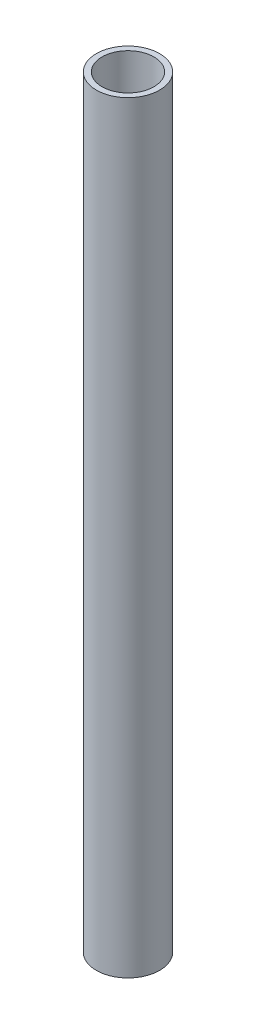
ISO-10303-21;
HEADER;
FILE_DESCRIPTION(('STEP AP214'),'2;1');
FILE_NAME('part.step','',(''),(''),'','','');
FILE_SCHEMA(('AUTOMOTIVE_DESIGN { 1 0 10303 214 1 1 1 1 }'));
ENDSEC;
DATA;
#1=APPLICATION_CONTEXT('core data for automotive mechanical design processes');
#2=APPLICATION_PROTOCOL_DEFINITION('international standard','automotive_design',2000,#1);
#3=PRODUCT_CONTEXT('',#1,'mechanical');
#4=PRODUCT('Part','Part','',(#3));
#5=PRODUCT_RELATED_PRODUCT_CATEGORY('part','',(#4));
#6=PRODUCT_DEFINITION_FORMATION('','',#4);
#7=PRODUCT_DEFINITION_CONTEXT('part definition',#1,'design');
#8=PRODUCT_DEFINITION('design','',#6,#7);
#9=PRODUCT_DEFINITION_SHAPE('','',#8);
#10=(LENGTH_UNIT() NAMED_UNIT(*) SI_UNIT(.MILLI.,.METRE.));
#11=(NAMED_UNIT(*) PLANE_ANGLE_UNIT() SI_UNIT($,.RADIAN.));
#12=(NAMED_UNIT(*) SI_UNIT($,.STERADIAN.) SOLID_ANGLE_UNIT());
#13=UNCERTAINTY_MEASURE_WITH_UNIT(LENGTH_MEASURE(1.E-05),#10,'distance_accuracy_value','');
#14=(GEOMETRIC_REPRESENTATION_CONTEXT(3) GLOBAL_UNCERTAINTY_ASSIGNED_CONTEXT((#13)) GLOBAL_UNIT_ASSIGNED_CONTEXT((#10,
#11,#12)) REPRESENTATION_CONTEXT('',''));
#15=CARTESIAN_POINT('',(0.,0.,0.));
#16=DIRECTION('',(0.,0.,1.));
#17=DIRECTION('',(1.,0.,0.));
#18=AXIS2_PLACEMENT_3D('',#15,#16,#17);
#19=CARTESIAN_POINT('',(0.,0.,0.));
#20=DIRECTION('',(0.,1.,0.));
#21=DIRECTION('',(0.,0.,1.));
#22=AXIS2_PLACEMENT_3D('',#19,#20,#21);
#23=CYLINDRICAL_SURFACE('',#22,17.272);
#24=CARTESIAN_POINT('',(0.,508.,0.));
#25=DIRECTION('',(0.,1.,0.));
#26=DIRECTION('',(0.,0.,1.));
#27=AXIS2_PLACEMENT_3D('',#24,#25,#26);
#28=CIRCLE('',#27,17.272);
#29=CARTESIAN_POINT('',(0.,508.,17.272));
#30=VERTEX_POINT('',#29);
#31=EDGE_CURVE('E18',#30,#30,#28,.F.);
#32=ORIENTED_EDGE('',*,*,#31,.F.);
#33=EDGE_LOOP('',(#32));
#34=FACE_BOUND('',#33,.T.);
#35=CARTESIAN_POINT('',(0.,0.,0.));
#36=DIRECTION('',(0.,1.,0.));
#37=DIRECTION('',(0.,0.,1.));
#38=AXIS2_PLACEMENT_3D('',#35,#36,#37);
#39=CIRCLE('',#38,17.272);
#40=CARTESIAN_POINT('',(0.,0.,17.272));
#41=VERTEX_POINT('',#40);
#42=EDGE_CURVE('E27',#41,#41,#39,.F.);
#43=ORIENTED_EDGE('',*,*,#42,.T.);
#44=EDGE_LOOP('',(#43));
#45=FACE_BOUND('',#44,.T.);
#46=ADVANCED_FACE('F15',(#34,#45),#23,.F.);
#47=CARTESIAN_POINT('',(0.,508.,0.));
#48=DIRECTION('',(0.,1.,0.));
#49=DIRECTION('',(0.,0.,1.));
#50=AXIS2_PLACEMENT_3D('',#47,#48,#49);
#51=PLANE('',#50);
#52=ORIENTED_EDGE('',*,*,#31,.T.);
#53=EDGE_LOOP('',(#52));
#54=FACE_BOUND('',#53,.T.);
#55=CARTESIAN_POINT('',(0.,508.,0.));
#56=DIRECTION('',(0.,1.,0.));
#57=DIRECTION('',(0.,0.,1.));
#58=AXIS2_PLACEMENT_3D('',#55,#56,#57);
#59=CIRCLE('',#58,21.082);
#60=CARTESIAN_POINT('',(0.,508.,21.082));
#61=VERTEX_POINT('',#60);
#62=EDGE_CURVE('E22',#61,#61,#59,.F.);
#63=ORIENTED_EDGE('',*,*,#62,.F.);
#64=EDGE_LOOP('',(#63));
#65=FACE_BOUND('',#64,.T.);
#66=ADVANCED_FACE('F35',(#54,#65),#51,.T.);
#67=CARTESIAN_POINT('',(0.,0.,0.));
#68=DIRECTION('',(0.,1.,0.));
#69=DIRECTION('',(0.,0.,1.));
#70=AXIS2_PLACEMENT_3D('',#67,#68,#69);
#71=PLANE('',#70);
#72=ORIENTED_EDGE('',*,*,#42,.F.);
#73=EDGE_LOOP('',(#72));
#74=FACE_BOUND('',#73,.T.);
#75=CARTESIAN_POINT('',(0.,0.,0.));
#76=DIRECTION('',(0.,1.,0.));
#77=DIRECTION('',(0.,0.,1.));
#78=AXIS2_PLACEMENT_3D('',#75,#76,#77);
#79=CIRCLE('',#78,21.082);
#80=CARTESIAN_POINT('',(0.,0.,21.082));
#81=VERTEX_POINT('',#80);
#82=EDGE_CURVE('E10',#81,#81,#79,.T.);
#83=ORIENTED_EDGE('',*,*,#82,.F.);
#84=EDGE_LOOP('',(#83));
#85=FACE_BOUND('',#84,.T.);
#86=ADVANCED_FACE('F43',(#74,#85),#71,.F.);
#87=CARTESIAN_POINT('',(0.,0.,0.));
#88=DIRECTION('',(0.,1.,0.));
#89=DIRECTION('',(0.,0.,1.));
#90=AXIS2_PLACEMENT_3D('',#87,#88,#89);
#91=CYLINDRICAL_SURFACE('',#90,21.082);
#92=ORIENTED_EDGE('',*,*,#62,.T.);
#93=EDGE_LOOP('',(#92));
#94=FACE_BOUND('',#93,.T.);
#95=ORIENTED_EDGE('',*,*,#82,.T.);
#96=EDGE_LOOP('',(#95));
#97=FACE_BOUND('',#96,.T.);
#98=ADVANCED_FACE('F44',(#94,#97),#91,.T.);
#99=CLOSED_SHELL('',(#46,#66,#86,#98));
#100=MANIFOLD_SOLID_BREP('B1',#99);
#101=ADVANCED_BREP_SHAPE_REPRESENTATION('',(#18,#100),#14);
#102=SHAPE_DEFINITION_REPRESENTATION(#9,#101);
ENDSEC;
END-ISO-10303-21;
